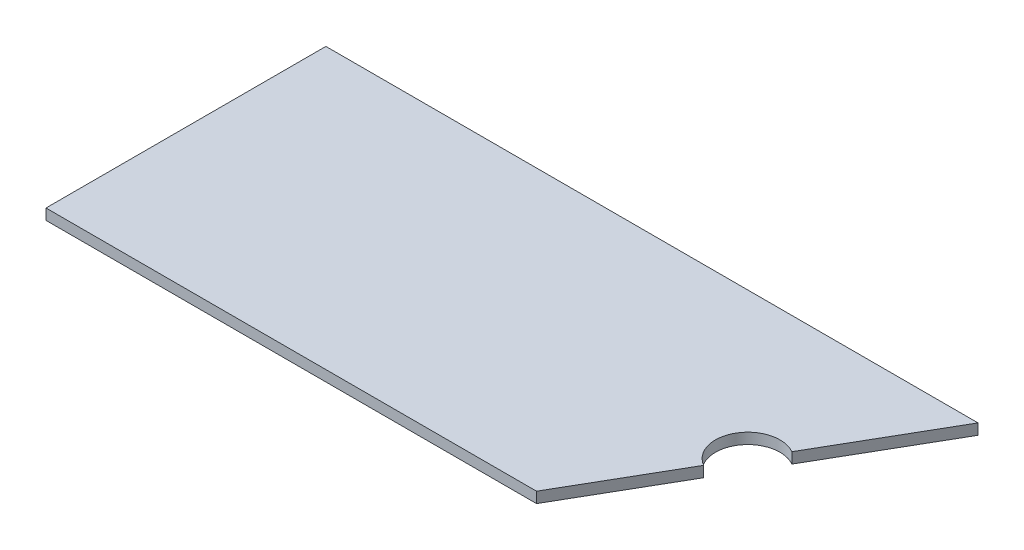
ISO-10303-21;
HEADER;
FILE_DESCRIPTION(('STEP AP214'),'2;1');
FILE_NAME('part.step','',(''),(''),'','','');
FILE_SCHEMA(('AUTOMOTIVE_DESIGN { 1 0 10303 214 1 1 1 1 }'));
ENDSEC;
DATA;
#1=APPLICATION_CONTEXT('core data for automotive mechanical design processes');
#2=APPLICATION_PROTOCOL_DEFINITION('international standard','automotive_design',2000,#1);
#3=PRODUCT_CONTEXT('',#1,'mechanical');
#4=PRODUCT('Part','Part','',(#3));
#5=PRODUCT_RELATED_PRODUCT_CATEGORY('part','',(#4));
#6=PRODUCT_DEFINITION_FORMATION('','',#4);
#7=PRODUCT_DEFINITION_CONTEXT('part definition',#1,'design');
#8=PRODUCT_DEFINITION('design','',#6,#7);
#9=PRODUCT_DEFINITION_SHAPE('','',#8);
#10=(LENGTH_UNIT() NAMED_UNIT(*) SI_UNIT(.MILLI.,.METRE.));
#11=(NAMED_UNIT(*) PLANE_ANGLE_UNIT() SI_UNIT($,.RADIAN.));
#12=(NAMED_UNIT(*) SI_UNIT($,.STERADIAN.) SOLID_ANGLE_UNIT());
#13=UNCERTAINTY_MEASURE_WITH_UNIT(LENGTH_MEASURE(1.E-05),#10,'distance_accuracy_value','');
#14=(GEOMETRIC_REPRESENTATION_CONTEXT(3) GLOBAL_UNCERTAINTY_ASSIGNED_CONTEXT((#13)) GLOBAL_UNIT_ASSIGNED_CONTEXT((#10,
#11,#12)) REPRESENTATION_CONTEXT('',''));
#15=CARTESIAN_POINT('',(0.,0.,0.));
#16=DIRECTION('',(0.,0.,1.));
#17=DIRECTION('',(1.,0.,0.));
#18=AXIS2_PLACEMENT_3D('',#15,#16,#17);
#19=CARTESIAN_POINT('',(0.,0.,0.));
#20=DIRECTION('',(0.,1.,0.));
#21=DIRECTION('',(0.,0.,1.));
#22=AXIS2_PLACEMENT_3D('',#19,#20,#21);
#23=PLANE('',#22);
#24=DIRECTION('',(1.,0.,0.));
#25=VECTOR('',#24,1.);
#26=CARTESIAN_POINT('',(355.9175,0.,85.725));
#27=LINE('',#26,#25);
#28=CARTESIAN_POINT('',(355.9175,0.,85.725));
#29=VERTEX_POINT('',#28);
#30=CARTESIAN_POINT('',(645.263144766024,0.,85.725));
#31=VERTEX_POINT('',#30);
#32=EDGE_CURVE('E57',#29,#31,#27,.T.);
#33=ORIENTED_EDGE('',*,*,#32,.F.);
#34=DIRECTION('',(0.,0.,1.));
#35=VECTOR('',#34,1.);
#36=CARTESIAN_POINT('',(355.9175,0.,-79.375));
#37=LINE('',#36,#35);
#38=CARTESIAN_POINT('',(355.9175,0.,-79.375));
#39=VERTEX_POINT('',#38);
#40=EDGE_CURVE('E85',#39,#29,#37,.T.);
#41=ORIENTED_EDGE('',*,*,#40,.F.);
#42=DIRECTION('',(-1.,0.,0.));
#43=VECTOR('',#42,1.);
#44=CARTESIAN_POINT('',(740.58367420942,0.,-79.375));
#45=LINE('',#44,#43);
#46=CARTESIAN_POINT('',(740.583674209378,0.,-79.375000000033));
#47=VERTEX_POINT('',#46);
#48=EDGE_CURVE('E84',#47,#39,#45,.T.);
#49=ORIENTED_EDGE('',*,*,#48,.F.);
#50=DIRECTION('',(0.500000000000017,0.,-0.866025403784429));
#51=VECTOR('',#50,1.);
#52=CARTESIAN_POINT('',(645.263144766024,0.,85.725));
#53=LINE('',#52,#51);
#54=CARTESIAN_POINT('',(700.395351930394,0.,-9.76678394209436));
#55=VERTEX_POINT('',#54);
#56=EDGE_CURVE('E74',#55,#47,#53,.T.);
#57=ORIENTED_EDGE('',*,*,#56,.F.);
#58=CARTESIAN_POINT('',(690.870351930396,0.,6.731));
#59=DIRECTION('',(0.,1.,0.));
#60=DIRECTION('',(0.,0.,1.));
#61=AXIS2_PLACEMENT_3D('',#58,#59,#60);
#62=CIRCLE('',#61,19.05);
#63=CARTESIAN_POINT('',(681.345351930393,0.,23.228783942092));
#64=VERTEX_POINT('',#63);
#65=EDGE_CURVE('E19',#55,#64,#62,.T.);
#66=ORIENTED_EDGE('',*,*,#65,.T.);
#67=DIRECTION('',(0.500000000000017,0.,-0.866025403784429));
#68=VECTOR('',#67,1.);
#69=CARTESIAN_POINT('',(645.263144766024,0.,85.725));
#70=LINE('',#69,#68);
#71=EDGE_CURVE('E103',#31,#64,#70,.T.);
#72=ORIENTED_EDGE('',*,*,#71,.F.);
#73=EDGE_LOOP('',(#33,#41,#49,#57,#66,#72));
#74=FACE_BOUND('',#73,.T.);
#75=ADVANCED_FACE('F16',(#74),#23,.F.);
#76=CARTESIAN_POINT('',(645.263144766024,0.,85.725));
#77=DIRECTION('',(0.866025403784429,0.,0.500000000000017));
#78=DIRECTION('',(0.500000000000017,0.,-0.866025403784429));
#79=AXIS2_PLACEMENT_3D('',#76,#77,#78);
#80=PLANE('',#79);
#81=DIRECTION('',(0.500000000001559,0.,-0.866025403783539));
#82=VECTOR('',#81,1.);
#83=CARTESIAN_POINT('',(700.395351930396,6.35,-9.76678394209282));
#84=LINE('',#83,#82);
#85=CARTESIAN_POINT('',(700.395351930396,6.35,-9.76678394209336));
#86=VERTEX_POINT('',#85);
#87=CARTESIAN_POINT('',(740.58367420942,6.35,-79.3750000000169));
#88=VERTEX_POINT('',#87);
#89=EDGE_CURVE('E126',#86,#88,#84,.T.);
#90=ORIENTED_EDGE('',*,*,#89,.F.);
#91=DIRECTION('',(0.,1.,0.));
#92=VECTOR('',#91,1.);
#93=CARTESIAN_POINT('',(700.395351930396,6.35,-9.76678394209336));
#94=LINE('',#93,#92);
#95=EDGE_CURVE('E81',#86,#55,#94,.F.);
#96=ORIENTED_EDGE('',*,*,#95,.T.);
#97=ORIENTED_EDGE('',*,*,#56,.T.);
#98=DIRECTION('',(0.,1.,0.));
#99=VECTOR('',#98,1.);
#100=CARTESIAN_POINT('',(740.58367420942,0.,-79.375));
#101=LINE('',#100,#99);
#102=EDGE_CURVE('E79',#88,#47,#101,.F.);
#103=ORIENTED_EDGE('',*,*,#102,.F.);
#104=EDGE_LOOP('',(#90,#96,#97,#103));
#105=FACE_BOUND('',#104,.T.);
#106=ADVANCED_FACE('F77',(#105),#80,.T.);
#107=CARTESIAN_POINT('',(740.58367420942,0.,-79.375));
#108=DIRECTION('',(0.,0.,-1.));
#109=DIRECTION('',(-1.,0.,0.));
#110=AXIS2_PLACEMENT_3D('',#107,#108,#109);
#111=PLANE('',#110);
#112=ORIENTED_EDGE('',*,*,#102,.T.);
#113=ORIENTED_EDGE('',*,*,#48,.T.);
#114=DIRECTION('',(0.,1.,0.));
#115=VECTOR('',#114,1.);
#116=CARTESIAN_POINT('',(355.9175,0.,-79.375));
#117=LINE('',#116,#115);
#118=CARTESIAN_POINT('',(355.9175,6.35,-79.3750000000169));
#119=VERTEX_POINT('',#118);
#120=EDGE_CURVE('E88',#119,#39,#117,.F.);
#121=ORIENTED_EDGE('',*,*,#120,.F.);
#122=DIRECTION('',(1.,0.,0.));
#123=VECTOR('',#122,1.);
#124=CARTESIAN_POINT('',(0.,6.35,-79.3750000000254));
#125=LINE('',#124,#123);
#126=EDGE_CURVE('E92',#88,#119,#125,.F.);
#127=ORIENTED_EDGE('',*,*,#126,.F.);
#128=EDGE_LOOP('',(#112,#113,#121,#127));
#129=FACE_BOUND('',#128,.T.);
#130=ADVANCED_FACE('F90',(#129),#111,.T.);
#131=CARTESIAN_POINT('',(355.9175,0.,-79.375));
#132=DIRECTION('',(-1.,0.,0.));
#133=DIRECTION('',(0.,0.,1.));
#134=AXIS2_PLACEMENT_3D('',#131,#132,#133);
#135=PLANE('',#134);
#136=ORIENTED_EDGE('',*,*,#120,.T.);
#137=ORIENTED_EDGE('',*,*,#40,.T.);
#138=DIRECTION('',(0.,1.,0.));
#139=VECTOR('',#138,1.);
#140=CARTESIAN_POINT('',(355.9175,0.,85.725));
#141=LINE('',#140,#139);
#142=CARTESIAN_POINT('',(355.9175,6.35,85.725));
#143=VERTEX_POINT('',#142);
#144=EDGE_CURVE('E109',#143,#29,#141,.F.);
#145=ORIENTED_EDGE('',*,*,#144,.F.);
#146=DIRECTION('',(0.,0.,1.));
#147=VECTOR('',#146,1.);
#148=CARTESIAN_POINT('',(355.9175,6.35,0.));
#149=LINE('',#148,#147);
#150=EDGE_CURVE('E125',#119,#143,#149,.T.);
#151=ORIENTED_EDGE('',*,*,#150,.F.);
#152=EDGE_LOOP('',(#136,#137,#145,#151));
#153=FACE_BOUND('',#152,.T.);
#154=ADVANCED_FACE('F153',(#153),#135,.T.);
#155=CARTESIAN_POINT('',(355.9175,0.,85.725));
#156=DIRECTION('',(0.,0.,1.));
#157=DIRECTION('',(1.,0.,0.));
#158=AXIS2_PLACEMENT_3D('',#155,#156,#157);
#159=PLANE('',#158);
#160=ORIENTED_EDGE('',*,*,#144,.T.);
#161=ORIENTED_EDGE('',*,*,#32,.T.);
#162=DIRECTION('',(0.,1.,0.));
#163=VECTOR('',#162,1.);
#164=CARTESIAN_POINT('',(645.263144766024,0.,85.725));
#165=LINE('',#164,#163);
#166=CARTESIAN_POINT('',(645.263144766024,6.35,85.725));
#167=VERTEX_POINT('',#166);
#168=EDGE_CURVE('E105',#167,#31,#165,.F.);
#169=ORIENTED_EDGE('',*,*,#168,.F.);
#170=DIRECTION('',(1.,0.,0.));
#171=VECTOR('',#170,1.);
#172=CARTESIAN_POINT('',(0.,6.35,85.725));
#173=LINE('',#172,#171);
#174=EDGE_CURVE('E129',#143,#167,#173,.T.);
#175=ORIENTED_EDGE('',*,*,#174,.F.);
#176=EDGE_LOOP('',(#160,#161,#169,#175));
#177=FACE_BOUND('',#176,.T.);
#178=ADVANCED_FACE('F152',(#177),#159,.T.);
#179=CARTESIAN_POINT('',(645.263144766024,0.,85.725));
#180=DIRECTION('',(0.866025403784429,0.,0.500000000000017));
#181=DIRECTION('',(0.500000000000017,0.,-0.866025403784429));
#182=AXIS2_PLACEMENT_3D('',#179,#180,#181);
#183=PLANE('',#182);
#184=ORIENTED_EDGE('',*,*,#71,.T.);
#185=DIRECTION('',(0.,1.,0.));
#186=VECTOR('',#185,1.);
#187=CARTESIAN_POINT('',(681.345351930394,6.35,23.2287839420927));
#188=LINE('',#187,#186);
#189=CARTESIAN_POINT('',(681.345351930395,6.35,23.228783942093));
#190=VERTEX_POINT('',#189);
#191=EDGE_CURVE('E33',#64,#190,#188,.T.);
#192=ORIENTED_EDGE('',*,*,#191,.T.);
#193=DIRECTION('',(0.500000000000065,0.,-0.866025403784401));
#194=VECTOR('',#193,1.);
#195=CARTESIAN_POINT('',(645.263144766024,6.35,85.725));
#196=LINE('',#195,#194);
#197=EDGE_CURVE('E25',#167,#190,#196,.T.);
#198=ORIENTED_EDGE('',*,*,#197,.F.);
#199=ORIENTED_EDGE('',*,*,#168,.T.);
#200=EDGE_LOOP('',(#184,#192,#198,#199));
#201=FACE_BOUND('',#200,.T.);
#202=ADVANCED_FACE('F151',(#201),#183,.T.);
#203=CARTESIAN_POINT('',(690.870351930396,6.35,6.731));
#204=DIRECTION('',(0.,1.,0.));
#205=DIRECTION('',(0.,0.,1.));
#206=AXIS2_PLACEMENT_3D('',#203,#204,#205);
#207=CYLINDRICAL_SURFACE('',#206,19.05);
#208=ORIENTED_EDGE('',*,*,#95,.F.);
#209=CARTESIAN_POINT('',(690.870351930396,6.35,6.731));
#210=DIRECTION('',(0.,1.,0.));
#211=DIRECTION('',(0.,0.,1.));
#212=AXIS2_PLACEMENT_3D('',#209,#210,#211);
#213=CIRCLE('',#212,19.05);
#214=EDGE_CURVE('E11',#190,#86,#213,.F.);
#215=ORIENTED_EDGE('',*,*,#214,.F.);
#216=ORIENTED_EDGE('',*,*,#191,.F.);
#217=ORIENTED_EDGE('',*,*,#65,.F.);
#218=EDGE_LOOP('',(#208,#215,#216,#217));
#219=FACE_BOUND('',#218,.T.);
#220=ADVANCED_FACE('F164',(#219),#207,.F.);
#221=CARTESIAN_POINT('',(0.,6.35,0.));
#222=DIRECTION('',(0.,1.,0.));
#223=DIRECTION('',(0.,0.,1.));
#224=AXIS2_PLACEMENT_3D('',#221,#222,#223);
#225=PLANE('',#224);
#226=ORIENTED_EDGE('',*,*,#214,.T.);
#227=ORIENTED_EDGE('',*,*,#89,.T.);
#228=ORIENTED_EDGE('',*,*,#126,.T.);
#229=ORIENTED_EDGE('',*,*,#150,.T.);
#230=ORIENTED_EDGE('',*,*,#174,.T.);
#231=ORIENTED_EDGE('',*,*,#197,.T.);
#232=EDGE_LOOP('',(#226,#227,#228,#229,#230,#231));
#233=FACE_BOUND('',#232,.T.);
#234=ADVANCED_FACE('F150',(#233),#225,.T.);
#235=CLOSED_SHELL('',(#75,#106,#130,#154,#178,#202,#220,#234));
#236=MANIFOLD_SOLID_BREP('B1',#235);
#237=ADVANCED_BREP_SHAPE_REPRESENTATION('',(#18,#236),#14);
#238=SHAPE_DEFINITION_REPRESENTATION(#9,#237);
ENDSEC;
END-ISO-10303-21;
